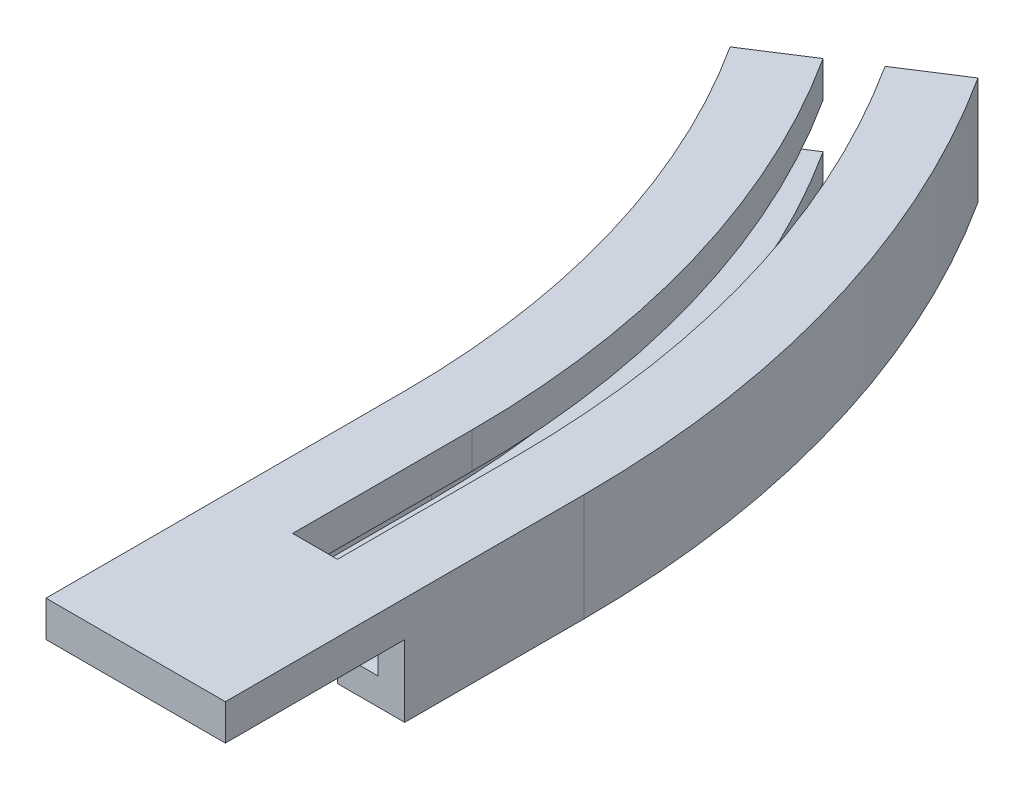
ISO-10303-21;
HEADER;
FILE_DESCRIPTION(('STEP AP214'),'2;1');
FILE_NAME('part.step','',(''),(''),'','','');
FILE_SCHEMA(('AUTOMOTIVE_DESIGN { 1 0 10303 214 1 1 1 1 }'));
ENDSEC;
DATA;
#1=APPLICATION_CONTEXT('core data for automotive mechanical design processes');
#2=APPLICATION_PROTOCOL_DEFINITION('international standard','automotive_design',2000,#1);
#3=PRODUCT_CONTEXT('',#1,'mechanical');
#4=PRODUCT('Part','Part','',(#3));
#5=PRODUCT_RELATED_PRODUCT_CATEGORY('part','',(#4));
#6=PRODUCT_DEFINITION_FORMATION('','',#4);
#7=PRODUCT_DEFINITION_CONTEXT('part definition',#1,'design');
#8=PRODUCT_DEFINITION('design','',#6,#7);
#9=PRODUCT_DEFINITION_SHAPE('','',#8);
#10=(LENGTH_UNIT() NAMED_UNIT(*) SI_UNIT(.MILLI.,.METRE.));
#11=(NAMED_UNIT(*) PLANE_ANGLE_UNIT() SI_UNIT($,.RADIAN.));
#12=(NAMED_UNIT(*) SI_UNIT($,.STERADIAN.) SOLID_ANGLE_UNIT());
#13=UNCERTAINTY_MEASURE_WITH_UNIT(LENGTH_MEASURE(1.E-05),#10,'distance_accuracy_value','');
#14=(GEOMETRIC_REPRESENTATION_CONTEXT(3) GLOBAL_UNCERTAINTY_ASSIGNED_CONTEXT((#13)) GLOBAL_UNIT_ASSIGNED_CONTEXT((#10,
#11,#12)) REPRESENTATION_CONTEXT('',''));
#15=CARTESIAN_POINT('',(0.,0.,0.));
#16=DIRECTION('',(0.,0.,1.));
#17=DIRECTION('',(1.,0.,0.));
#18=AXIS2_PLACEMENT_3D('',#15,#16,#17);
#19=CARTESIAN_POINT('',(0.,4.,0.));
#20=DIRECTION('',(-0.540827674130089,0.,-0.841133418011101));
#21=DIRECTION('',(-0.841133418011101,0.,0.540827674130089));
#22=AXIS2_PLACEMENT_3D('',#19,#20,#21);
#23=PLANE('',#22);
#24=DIRECTION('',(0.,1.,0.));
#25=VECTOR('',#24,1.);
#26=CARTESIAN_POINT('',(90.4218424361934,-39.,-58.1389749689846));
#27=LINE('',#26,#25);
#28=CARTESIAN_POINT('',(90.4218424361934,-8.,-58.1389749689846));
#29=VERTEX_POINT('',#28);
#30=CARTESIAN_POINT('',(90.4218424361934,-5.,-58.1389749689846));
#31=VERTEX_POINT('',#30);
#32=EDGE_CURVE('E249',#29,#31,#27,.T.);
#33=ORIENTED_EDGE('',*,*,#32,.T.);
#34=DIRECTION('',(0.84113341801112,0.,-0.54082767413006));
#35=VECTOR('',#34,1.);
#36=CARTESIAN_POINT('',(94.2069428172436,-5.,-60.5726995025703));
#37=LINE('',#36,#35);
#38=CARTESIAN_POINT('',(94.2069428172433,-5.,-60.57269950257));
#39=VERTEX_POINT('',#38);
#40=EDGE_CURVE('E304',#31,#39,#37,.T.);
#41=ORIENTED_EDGE('',*,*,#40,.T.);
#42=DIRECTION('',(0.,1.,0.));
#43=VECTOR('',#42,1.);
#44=CARTESIAN_POINT('',(94.206942817244,-5.,-60.5726995025704));
#45=LINE('',#44,#43);
#46=CARTESIAN_POINT('',(94.2069428172433,0.,-60.57269950257));
#47=VERTEX_POINT('',#46);
#48=EDGE_CURVE('E373',#39,#47,#45,.T.);
#49=ORIENTED_EDGE('',*,*,#48,.T.);
#50=DIRECTION('',(0.841133418011101,0.,-0.540827674130089));
#51=VECTOR('',#50,1.);
#52=CARTESIAN_POINT('',(0.,0.,0.));
#53=LINE('',#52,#51);
#54=CARTESIAN_POINT('',(90.4218424361934,0.,-58.1389749689846));
#55=VERTEX_POINT('',#54);
#56=EDGE_CURVE('E429',#55,#47,#53,.T.);
#57=ORIENTED_EDGE('',*,*,#56,.F.);
#58=DIRECTION('',(0.,-1.,0.));
#59=VECTOR('',#58,1.);
#60=CARTESIAN_POINT('',(90.4218424361934,4.,-58.1389749689846));
#61=LINE('',#60,#59);
#62=CARTESIAN_POINT('',(90.4218424361934,4.,-58.1389749689846));
#63=VERTEX_POINT('',#62);
#64=EDGE_CURVE('E472',#63,#55,#61,.T.);
#65=ORIENTED_EDGE('',*,*,#64,.F.);
#66=DIRECTION('',(0.841133418011101,0.,-0.540827674130089));
#67=VECTOR('',#66,1.);
#68=CARTESIAN_POINT('',(0.,4.,0.));
#69=LINE('',#68,#67);
#70=CARTESIAN_POINT('',(96.7303430712767,4.,-62.1951825249603));
#71=VERTEX_POINT('',#70);
#72=EDGE_CURVE('E395',#63,#71,#69,.T.);
#73=ORIENTED_EDGE('',*,*,#72,.T.);
#74=DIRECTION('',(0.,-1.,0.));
#75=VECTOR('',#74,1.);
#76=CARTESIAN_POINT('',(96.7303430712767,4.,-62.1951825249603));
#77=LINE('',#76,#75);
#78=CARTESIAN_POINT('',(96.7303430712767,-8.,-62.1951825249602));
#79=VERTEX_POINT('',#78);
#80=EDGE_CURVE('E269',#71,#79,#77,.T.);
#81=ORIENTED_EDGE('',*,*,#80,.T.);
#82=DIRECTION('',(0.841133418011101,0.,-0.54082767413009));
#83=VECTOR('',#82,1.);
#84=CARTESIAN_POINT('',(79.9076747110546,-8.,-51.3786290423585));
#85=LINE('',#84,#83);
#86=EDGE_CURVE('E264',#29,#79,#85,.T.);
#87=ORIENTED_EDGE('',*,*,#86,.F.);
#88=EDGE_LOOP('',(#33,#41,#49,#57,#65,#73,#81,#87));
#89=FACE_BOUND('',#88,.T.);
#90=ADVANCED_FACE('F77',(#89),#23,.T.);
#91=CARTESIAN_POINT('',(-1.15648231731783E-13,-5.,19.9999999999993));
#92=DIRECTION('',(0.,0.,-1.));
#93=DIRECTION('',(-1.,0.,0.));
#94=AXIS2_PLACEMENT_3D('',#91,#92,#93);
#95=PLANE('',#94);
#96=DIRECTION('',(-1.,0.,0.));
#97=VECTOR('',#96,1.);
#98=CARTESIAN_POINT('',(98.,-5.,20.));
#99=LINE('',#98,#97);
#100=CARTESIAN_POINT('',(112.,-5.,20.));
#101=VERTEX_POINT('',#100);
#102=CARTESIAN_POINT('',(107.5,-5.,20.));
#103=VERTEX_POINT('',#102);
#104=EDGE_CURVE('E280',#101,#103,#99,.T.);
#105=ORIENTED_EDGE('',*,*,#104,.T.);
#106=DIRECTION('',(0.,1.,0.));
#107=VECTOR('',#106,1.);
#108=CARTESIAN_POINT('',(107.5,-39.,20.));
#109=LINE('',#108,#107);
#110=CARTESIAN_POINT('',(107.5,-8.,20.));
#111=VERTEX_POINT('',#110);
#112=EDGE_CURVE('E499',#111,#103,#109,.T.);
#113=ORIENTED_EDGE('',*,*,#112,.F.);
#114=DIRECTION('',(-1.,0.,0.));
#115=VECTOR('',#114,1.);
#116=CARTESIAN_POINT('',(115.,-8.,20.));
#117=LINE('',#116,#115);
#118=CARTESIAN_POINT('',(115.,-8.,20.));
#119=VERTEX_POINT('',#118);
#120=EDGE_CURVE('E291',#119,#111,#117,.T.);
#121=ORIENTED_EDGE('',*,*,#120,.F.);
#122=DIRECTION('',(0.,1.,0.));
#123=VECTOR('',#122,1.);
#124=CARTESIAN_POINT('',(115.,-5.,20.));
#125=LINE('',#124,#123);
#126=CARTESIAN_POINT('',(115.,0.,20.));
#127=VERTEX_POINT('',#126);
#128=EDGE_CURVE('E369',#119,#127,#125,.T.);
#129=ORIENTED_EDGE('',*,*,#128,.T.);
#130=DIRECTION('',(-1.,0.,0.));
#131=VECTOR('',#130,1.);
#132=CARTESIAN_POINT('',(-1.15648231731783E-13,0.,19.9999999999993));
#133=LINE('',#132,#131);
#134=CARTESIAN_POINT('',(112.,0.,20.));
#135=VERTEX_POINT('',#134);
#136=EDGE_CURVE('E356',#127,#135,#133,.T.);
#137=ORIENTED_EDGE('',*,*,#136,.T.);
#138=DIRECTION('',(0.,1.,0.));
#139=VECTOR('',#138,1.);
#140=CARTESIAN_POINT('',(112.,-5.,20.));
#141=LINE('',#140,#139);
#142=EDGE_CURVE('E365',#101,#135,#141,.T.);
#143=ORIENTED_EDGE('',*,*,#142,.F.);
#144=EDGE_LOOP('',(#105,#113,#121,#129,#137,#143));
#145=FACE_BOUND('',#144,.T.);
#146=ADVANCED_FACE('F503',(#145),#95,.F.);
#147=CARTESIAN_POINT('',(0.,-5.,0.));
#148=DIRECTION('',(0.,-1.,0.));
#149=DIRECTION('',(0.,0.,-1.));
#150=AXIS2_PLACEMENT_3D('',#147,#148,#149);
#151=PLANE('',#150);
#152=ORIENTED_EDGE('',*,*,#40,.F.);
#153=CARTESIAN_POINT('',(0.,-5.,0.));
#154=DIRECTION('',(0.,-1.,0.));
#155=DIRECTION('',(0.,0.,-1.));
#156=AXIS2_PLACEMENT_3D('',#153,#154,#155);
#157=CIRCLE('',#156,107.5);
#158=CARTESIAN_POINT('',(107.5,-5.,0.));
#159=VERTEX_POINT('',#158);
#160=EDGE_CURVE('E254',#31,#159,#157,.T.);
#161=ORIENTED_EDGE('',*,*,#160,.T.);
#162=DIRECTION('',(0.,0.,1.));
#163=VECTOR('',#162,1.);
#164=CARTESIAN_POINT('',(107.5,-5.,0.));
#165=LINE('',#164,#163);
#166=EDGE_CURVE('E527',#159,#103,#165,.T.);
#167=ORIENTED_EDGE('',*,*,#166,.T.);
#168=ORIENTED_EDGE('',*,*,#104,.F.);
#169=DIRECTION('',(0.,0.,1.));
#170=VECTOR('',#169,1.);
#171=CARTESIAN_POINT('',(112.,-5.,0.));
#172=LINE('',#171,#170);
#173=CARTESIAN_POINT('',(112.,-5.,0.));
#174=VERTEX_POINT('',#173);
#175=EDGE_CURVE('E348',#174,#101,#172,.T.);
#176=ORIENTED_EDGE('',*,*,#175,.F.);
#177=CARTESIAN_POINT('',(0.,-5.,0.));
#178=DIRECTION('',(0.,-1.,0.));
#179=DIRECTION('',(0.,0.,-1.));
#180=AXIS2_PLACEMENT_3D('',#177,#178,#179);
#181=CIRCLE('',#180,112.);
#182=EDGE_CURVE('E344',#39,#174,#181,.T.);
#183=ORIENTED_EDGE('',*,*,#182,.F.);
#184=EDGE_LOOP('',(#152,#161,#167,#168,#176,#183));
#185=FACE_BOUND('',#184,.T.);
#186=ADVANCED_FACE('F525',(#185),#151,.F.);
#187=CARTESIAN_POINT('',(0.,-8.,0.));
#188=DIRECTION('',(0.,-1.,0.));
#189=DIRECTION('',(0.,0.,-1.));
#190=AXIS2_PLACEMENT_3D('',#187,#188,#189);
#191=PLANE('',#190);
#192=CARTESIAN_POINT('',(0.,-8.,0.));
#193=DIRECTION('',(0.,-1.,0.));
#194=DIRECTION('',(0.,0.,-1.));
#195=AXIS2_PLACEMENT_3D('',#192,#193,#194);
#196=CIRCLE('',#195,107.5);
#197=CARTESIAN_POINT('',(107.5,-8.,0.));
#198=VERTEX_POINT('',#197);
#199=EDGE_CURVE('E12',#29,#198,#196,.T.);
#200=ORIENTED_EDGE('',*,*,#199,.F.);
#201=ORIENTED_EDGE('',*,*,#86,.T.);
#202=CARTESIAN_POINT('',(0.,-8.,0.));
#203=DIRECTION('',(0.,-1.,0.));
#204=DIRECTION('',(0.,0.,-1.));
#205=AXIS2_PLACEMENT_3D('',#202,#203,#204);
#206=CIRCLE('',#205,115.);
#207=CARTESIAN_POINT('',(115.,-8.,0.));
#208=VERTEX_POINT('',#207);
#209=EDGE_CURVE('E278',#79,#208,#206,.T.);
#210=ORIENTED_EDGE('',*,*,#209,.T.);
#211=DIRECTION('',(0.,0.,1.));
#212=VECTOR('',#211,1.);
#213=CARTESIAN_POINT('',(115.,-8.,0.));
#214=LINE('',#213,#212);
#215=EDGE_CURVE('E286',#208,#119,#214,.T.);
#216=ORIENTED_EDGE('',*,*,#215,.T.);
#217=ORIENTED_EDGE('',*,*,#120,.T.);
#218=DIRECTION('',(0.,0.,1.));
#219=VECTOR('',#218,1.);
#220=CARTESIAN_POINT('',(107.5,-8.,0.));
#221=LINE('',#220,#219);
#222=EDGE_CURVE('E86',#198,#111,#221,.T.);
#223=ORIENTED_EDGE('',*,*,#222,.F.);
#224=EDGE_LOOP('',(#200,#201,#210,#216,#217,#223));
#225=FACE_BOUND('',#224,.T.);
#226=ADVANCED_FACE('F262',(#225),#191,.T.);
#227=CARTESIAN_POINT('',(0.,0.,0.));
#228=DIRECTION('',(0.,1.,0.));
#229=DIRECTION('',(0.,0.,1.));
#230=AXIS2_PLACEMENT_3D('',#227,#228,#229);
#231=PLANE('',#230);
#232=CARTESIAN_POINT('',(0.,0.,0.));
#233=DIRECTION('',(0.,-1.,0.));
#234=DIRECTION('',(0.,0.,-1.));
#235=AXIS2_PLACEMENT_3D('',#232,#233,#234);
#236=CIRCLE('',#235,98.);
#237=CARTESIAN_POINT('',(82.4310749650879,0.,-53.0011120647488));
#238=VERTEX_POINT('',#237);
#239=CARTESIAN_POINT('',(98.,0.,0.));
#240=VERTEX_POINT('',#239);
#241=EDGE_CURVE('E298',#238,#240,#236,.T.);
#242=ORIENTED_EDGE('',*,*,#241,.F.);
#243=DIRECTION('',(0.841133418011101,0.,-0.540827674130089));
#244=VECTOR('',#243,1.);
#245=CARTESIAN_POINT('',(0.,0.,0.));
#246=LINE('',#245,#244);
#247=CARTESIAN_POINT('',(86.2161753461379,0.,-55.4348365983342));
#248=VERTEX_POINT('',#247);
#249=EDGE_CURVE('E383',#238,#248,#246,.T.);
#250=ORIENTED_EDGE('',*,*,#249,.T.);
#251=CARTESIAN_POINT('',(0.,0.,0.));
#252=DIRECTION('',(0.,1.,0.));
#253=DIRECTION('',(0.,0.,1.));
#254=AXIS2_PLACEMENT_3D('',#251,#252,#253);
#255=CIRCLE('',#254,102.5);
#256=CARTESIAN_POINT('',(102.5,0.,0.));
#257=VERTEX_POINT('',#256);
#258=EDGE_CURVE('E447',#257,#248,#255,.T.);
#259=ORIENTED_EDGE('',*,*,#258,.F.);
#260=DIRECTION('',(0.,0.,1.));
#261=VECTOR('',#260,1.);
#262=CARTESIAN_POINT('',(102.5,0.,0.));
#263=LINE('',#262,#261);
#264=CARTESIAN_POINT('',(102.5,0.,20.));
#265=VERTEX_POINT('',#264);
#266=EDGE_CURVE('E443',#257,#265,#263,.T.);
#267=ORIENTED_EDGE('',*,*,#266,.T.);
#268=DIRECTION('',(-1.,0.,0.));
#269=VECTOR('',#268,1.);
#270=CARTESIAN_POINT('',(0.,0.,20.));
#271=LINE('',#270,#269);
#272=CARTESIAN_POINT('',(107.5,0.,20.));
#273=VERTEX_POINT('',#272);
#274=EDGE_CURVE('E439',#273,#265,#271,.T.);
#275=ORIENTED_EDGE('',*,*,#274,.F.);
#276=DIRECTION('',(0.,0.,1.));
#277=VECTOR('',#276,1.);
#278=CARTESIAN_POINT('',(107.5,0.,0.));
#279=LINE('',#278,#277);
#280=CARTESIAN_POINT('',(107.5,0.,0.));
#281=VERTEX_POINT('',#280);
#282=EDGE_CURVE('E436',#281,#273,#279,.T.);
#283=ORIENTED_EDGE('',*,*,#282,.F.);
#284=CARTESIAN_POINT('',(0.,0.,0.));
#285=DIRECTION('',(0.,1.,0.));
#286=DIRECTION('',(0.,0.,1.));
#287=AXIS2_PLACEMENT_3D('',#284,#285,#286);
#288=CIRCLE('',#287,107.5);
#289=EDGE_CURVE('E432',#281,#55,#288,.T.);
#290=ORIENTED_EDGE('',*,*,#289,.T.);
#291=ORIENTED_EDGE('',*,*,#56,.T.);
#292=CARTESIAN_POINT('',(0.,0.,0.));
#293=DIRECTION('',(0.,-1.,0.));
#294=DIRECTION('',(0.,0.,-1.));
#295=AXIS2_PLACEMENT_3D('',#292,#293,#294);
#296=CIRCLE('',#295,112.);
#297=CARTESIAN_POINT('',(112.,0.,0.));
#298=VERTEX_POINT('',#297);
#299=EDGE_CURVE('E343',#47,#298,#296,.T.);
#300=ORIENTED_EDGE('',*,*,#299,.T.);
#301=DIRECTION('',(0.,0.,1.));
#302=VECTOR('',#301,1.);
#303=CARTESIAN_POINT('',(112.,0.,0.));
#304=LINE('',#303,#302);
#305=EDGE_CURVE('E349',#298,#135,#304,.T.);
#306=ORIENTED_EDGE('',*,*,#305,.T.);
#307=ORIENTED_EDGE('',*,*,#136,.F.);
#308=DIRECTION('',(0.,0.,-1.));
#309=VECTOR('',#308,1.);
#310=CARTESIAN_POINT('',(115.,0.,0.));
#311=LINE('',#310,#309);
#312=CARTESIAN_POINT('',(115.,0.,40.));
#313=VERTEX_POINT('',#312);
#314=EDGE_CURVE('E425',#313,#127,#311,.T.);
#315=ORIENTED_EDGE('',*,*,#314,.F.);
#316=DIRECTION('',(1.,0.,0.));
#317=VECTOR('',#316,1.);
#318=CARTESIAN_POINT('',(0.,0.,40.));
#319=LINE('',#318,#317);
#320=CARTESIAN_POINT('',(95.,0.,40.));
#321=VERTEX_POINT('',#320);
#322=EDGE_CURVE('E422',#321,#313,#319,.T.);
#323=ORIENTED_EDGE('',*,*,#322,.F.);
#324=DIRECTION('',(0.,0.,1.));
#325=VECTOR('',#324,1.);
#326=CARTESIAN_POINT('',(95.,0.,0.));
#327=LINE('',#326,#325);
#328=CARTESIAN_POINT('',(95.,0.,20.));
#329=VERTEX_POINT('',#328);
#330=EDGE_CURVE('E377',#329,#321,#327,.T.);
#331=ORIENTED_EDGE('',*,*,#330,.F.);
#332=DIRECTION('',(-1.,0.,0.));
#333=VECTOR('',#332,1.);
#334=CARTESIAN_POINT('',(0.,0.,20.0000000000001));
#335=LINE('',#334,#333);
#336=CARTESIAN_POINT('',(98.,0.,20.));
#337=VERTEX_POINT('',#336);
#338=EDGE_CURVE('E313',#337,#329,#335,.T.);
#339=ORIENTED_EDGE('',*,*,#338,.F.);
#340=DIRECTION('',(0.,0.,1.));
#341=VECTOR('',#340,1.);
#342=CARTESIAN_POINT('',(98.,0.,0.));
#343=LINE('',#342,#341);
#344=EDGE_CURVE('E321',#240,#337,#343,.T.);
#345=ORIENTED_EDGE('',*,*,#344,.F.);
#346=EDGE_LOOP('',(#242,#250,#259,#267,#275,#283,#290,#291,#300,#306,#307,#315,#323,#331,#339,#345));
#347=FACE_BOUND('',#346,.T.);
#348=ADVANCED_FACE('F516',(#347),#231,.F.);
#349=CARTESIAN_POINT('',(0.,4.,0.));
#350=DIRECTION('',(0.,-1.,0.));
#351=DIRECTION('',(0.,0.,-1.));
#352=AXIS2_PLACEMENT_3D('',#349,#350,#351);
#353=CYLINDRICAL_SURFACE('',#352,95.);
#354=DIRECTION('',(0.,-1.,0.));
#355=VECTOR('',#354,1.);
#356=CARTESIAN_POINT('',(79.9076747110546,4.,-51.3786290423584));
#357=LINE('',#356,#355);
#358=CARTESIAN_POINT('',(79.9076747110546,4.,-51.3786290423584));
#359=VERTEX_POINT('',#358);
#360=CARTESIAN_POINT('',(79.9076747110546,-8.,-51.3786290423585));
#361=VERTEX_POINT('',#360);
#362=EDGE_CURVE('E419',#359,#361,#357,.T.);
#363=ORIENTED_EDGE('',*,*,#362,.T.);
#364=CARTESIAN_POINT('',(0.,-8.,0.));
#365=DIRECTION('',(0.,1.,0.));
#366=DIRECTION('',(0.,0.,-1.));
#367=AXIS2_PLACEMENT_3D('',#364,#365,#366);
#368=CIRCLE('',#367,95.);
#369=CARTESIAN_POINT('',(95.,-8.,0.));
#370=VERTEX_POINT('',#369);
#371=EDGE_CURVE('E273',#370,#361,#368,.T.);
#372=ORIENTED_EDGE('',*,*,#371,.F.);
#373=DIRECTION('',(0.,-1.,0.));
#374=VECTOR('',#373,1.);
#375=CARTESIAN_POINT('',(95.,4.,0.));
#376=LINE('',#375,#374);
#377=CARTESIAN_POINT('',(95.,4.,0.));
#378=VERTEX_POINT('',#377);
#379=EDGE_CURVE('E488',#378,#370,#376,.T.);
#380=ORIENTED_EDGE('',*,*,#379,.F.);
#381=CARTESIAN_POINT('',(0.,4.,0.));
#382=DIRECTION('',(0.,1.,0.));
#383=DIRECTION('',(0.,0.,1.));
#384=AXIS2_PLACEMENT_3D('',#381,#382,#383);
#385=CIRCLE('',#384,95.);
#386=EDGE_CURVE('E378',#378,#359,#385,.T.);
#387=ORIENTED_EDGE('',*,*,#386,.T.);
#388=EDGE_LOOP('',(#363,#372,#380,#387));
#389=FACE_BOUND('',#388,.T.);
#390=ADVANCED_FACE('F79',(#389),#353,.F.);
#391=CARTESIAN_POINT('',(95.,4.,0.));
#392=DIRECTION('',(1.,0.,0.));
#393=DIRECTION('',(0.,0.,-1.));
#394=AXIS2_PLACEMENT_3D('',#391,#392,#393);
#395=PLANE('',#394);
#396=ORIENTED_EDGE('',*,*,#379,.T.);
#397=DIRECTION('',(0.,0.,-1.));
#398=VECTOR('',#397,1.);
#399=CARTESIAN_POINT('',(95.,-8.,20.));
#400=LINE('',#399,#398);
#401=CARTESIAN_POINT('',(95.,-8.,20.));
#402=VERTEX_POINT('',#401);
#403=EDGE_CURVE('E294',#402,#370,#400,.T.);
#404=ORIENTED_EDGE('',*,*,#403,.F.);
#405=DIRECTION('',(0.,1.,0.));
#406=VECTOR('',#405,1.);
#407=CARTESIAN_POINT('',(95.,-5.,20.));
#408=LINE('',#407,#406);
#409=EDGE_CURVE('E317',#402,#329,#408,.T.);
#410=ORIENTED_EDGE('',*,*,#409,.T.);
#411=ORIENTED_EDGE('',*,*,#330,.T.);
#412=DIRECTION('',(0.,-1.,0.));
#413=VECTOR('',#412,1.);
#414=CARTESIAN_POINT('',(95.,4.,40.));
#415=LINE('',#414,#413);
#416=CARTESIAN_POINT('',(95.,4.,40.));
#417=VERTEX_POINT('',#416);
#418=EDGE_CURVE('E484',#417,#321,#415,.T.);
#419=ORIENTED_EDGE('',*,*,#418,.F.);
#420=DIRECTION('',(0.,0.,1.));
#421=VECTOR('',#420,1.);
#422=CARTESIAN_POINT('',(95.,4.,0.));
#423=LINE('',#422,#421);
#424=EDGE_CURVE('E382',#378,#417,#423,.T.);
#425=ORIENTED_EDGE('',*,*,#424,.F.);
#426=EDGE_LOOP('',(#396,#404,#410,#411,#419,#425));
#427=FACE_BOUND('',#426,.T.);
#428=ADVANCED_FACE('F639',(#427),#395,.F.);
#429=CARTESIAN_POINT('',(0.,4.,40.));
#430=DIRECTION('',(0.,0.,-1.));
#431=DIRECTION('',(-1.,0.,0.));
#432=AXIS2_PLACEMENT_3D('',#429,#430,#431);
#433=PLANE('',#432);
#434=ORIENTED_EDGE('',*,*,#322,.T.);
#435=DIRECTION('',(0.,-1.,0.));
#436=VECTOR('',#435,1.);
#437=CARTESIAN_POINT('',(115.,4.,40.));
#438=LINE('',#437,#436);
#439=CARTESIAN_POINT('',(115.,4.,40.));
#440=VERTEX_POINT('',#439);
#441=EDGE_CURVE('E480',#440,#313,#438,.T.);
#442=ORIENTED_EDGE('',*,*,#441,.F.);
#443=DIRECTION('',(1.,0.,0.));
#444=VECTOR('',#443,1.);
#445=CARTESIAN_POINT('',(0.,4.,40.));
#446=LINE('',#445,#444);
#447=EDGE_CURVE('E386',#417,#440,#446,.T.);
#448=ORIENTED_EDGE('',*,*,#447,.F.);
#449=ORIENTED_EDGE('',*,*,#418,.T.);
#450=EDGE_LOOP('',(#434,#442,#448,#449));
#451=FACE_BOUND('',#450,.T.);
#452=ADVANCED_FACE('F634',(#451),#433,.F.);
#453=CARTESIAN_POINT('',(115.,4.,0.));
#454=DIRECTION('',(-1.,0.,0.));
#455=DIRECTION('',(0.,0.,1.));
#456=AXIS2_PLACEMENT_3D('',#453,#454,#455);
#457=PLANE('',#456);
#458=ORIENTED_EDGE('',*,*,#314,.T.);
#459=ORIENTED_EDGE('',*,*,#128,.F.);
#460=ORIENTED_EDGE('',*,*,#215,.F.);
#461=DIRECTION('',(0.,-1.,0.));
#462=VECTOR('',#461,1.);
#463=CARTESIAN_POINT('',(115.,4.,0.));
#464=LINE('',#463,#462);
#465=CARTESIAN_POINT('',(115.,4.,0.));
#466=VERTEX_POINT('',#465);
#467=EDGE_CURVE('E477',#466,#208,#464,.T.);
#468=ORIENTED_EDGE('',*,*,#467,.F.);
#469=DIRECTION('',(0.,0.,-1.));
#470=VECTOR('',#469,1.);
#471=CARTESIAN_POINT('',(115.,4.,0.));
#472=LINE('',#471,#470);
#473=EDGE_CURVE('E389',#440,#466,#472,.T.);
#474=ORIENTED_EDGE('',*,*,#473,.F.);
#475=ORIENTED_EDGE('',*,*,#441,.T.);
#476=EDGE_LOOP('',(#458,#459,#460,#468,#474,#475));
#477=FACE_BOUND('',#476,.T.);
#478=ADVANCED_FACE('F511',(#477),#457,.F.);
#479=CARTESIAN_POINT('',(0.,4.,0.));
#480=DIRECTION('',(0.,-1.,0.));
#481=DIRECTION('',(0.,0.,-1.));
#482=AXIS2_PLACEMENT_3D('',#479,#480,#481);
#483=CYLINDRICAL_SURFACE('',#482,115.);
#484=ORIENTED_EDGE('',*,*,#467,.T.);
#485=ORIENTED_EDGE('',*,*,#209,.F.);
#486=ORIENTED_EDGE('',*,*,#80,.F.);
#487=CARTESIAN_POINT('',(0.,4.,0.));
#488=DIRECTION('',(0.,1.,0.));
#489=DIRECTION('',(0.,0.,1.));
#490=AXIS2_PLACEMENT_3D('',#487,#488,#489);
#491=CIRCLE('',#490,115.);
#492=EDGE_CURVE('E392',#466,#71,#491,.T.);
#493=ORIENTED_EDGE('',*,*,#492,.F.);
#494=EDGE_LOOP('',(#484,#485,#486,#493));
#495=FACE_BOUND('',#494,.T.);
#496=ADVANCED_FACE('F625',(#495),#483,.T.);
#497=CARTESIAN_POINT('',(0.,4.,0.));
#498=DIRECTION('',(0.,-1.,0.));
#499=DIRECTION('',(0.,0.,-1.));
#500=AXIS2_PLACEMENT_3D('',#497,#498,#499);
#501=CYLINDRICAL_SURFACE('',#500,107.5);
#502=ORIENTED_EDGE('',*,*,#289,.F.);
#503=DIRECTION('',(0.,-1.,0.));
#504=VECTOR('',#503,1.);
#505=CARTESIAN_POINT('',(107.5,4.,0.));
#506=LINE('',#505,#504);
#507=CARTESIAN_POINT('',(107.5,4.,0.));
#508=VERTEX_POINT('',#507);
#509=EDGE_CURVE('E469',#508,#281,#506,.T.);
#510=ORIENTED_EDGE('',*,*,#509,.F.);
#511=CARTESIAN_POINT('',(0.,4.,0.));
#512=DIRECTION('',(0.,1.,0.));
#513=DIRECTION('',(0.,0.,1.));
#514=AXIS2_PLACEMENT_3D('',#511,#512,#513);
#515=CIRCLE('',#514,107.5);
#516=EDGE_CURVE('E398',#508,#63,#515,.T.);
#517=ORIENTED_EDGE('',*,*,#516,.T.);
#518=ORIENTED_EDGE('',*,*,#64,.T.);
#519=EDGE_LOOP('',(#502,#510,#517,#518));
#520=FACE_BOUND('',#519,.T.);
#521=ADVANCED_FACE('F620',(#520),#501,.F.);
#522=CARTESIAN_POINT('',(107.5,4.,0.));
#523=DIRECTION('',(1.,0.,0.));
#524=DIRECTION('',(0.,0.,-1.));
#525=AXIS2_PLACEMENT_3D('',#522,#523,#524);
#526=PLANE('',#525);
#527=ORIENTED_EDGE('',*,*,#282,.T.);
#528=DIRECTION('',(0.,-1.,0.));
#529=VECTOR('',#528,1.);
#530=CARTESIAN_POINT('',(107.5,4.,20.));
#531=LINE('',#530,#529);
#532=CARTESIAN_POINT('',(107.5,4.,20.));
#533=VERTEX_POINT('',#532);
#534=EDGE_CURVE('E465',#533,#273,#531,.T.);
#535=ORIENTED_EDGE('',*,*,#534,.F.);
#536=DIRECTION('',(0.,0.,1.));
#537=VECTOR('',#536,1.);
#538=CARTESIAN_POINT('',(107.5,4.,0.));
#539=LINE('',#538,#537);
#540=EDGE_CURVE('E402',#508,#533,#539,.T.);
#541=ORIENTED_EDGE('',*,*,#540,.F.);
#542=ORIENTED_EDGE('',*,*,#509,.T.);
#543=EDGE_LOOP('',(#527,#535,#541,#542));
#544=FACE_BOUND('',#543,.T.);
#545=ADVANCED_FACE('F632',(#544),#526,.F.);
#546=CARTESIAN_POINT('',(0.,4.,20.));
#547=DIRECTION('',(0.,0.,1.));
#548=DIRECTION('',(1.,0.,0.));
#549=AXIS2_PLACEMENT_3D('',#546,#547,#548);
#550=PLANE('',#549);
#551=ORIENTED_EDGE('',*,*,#274,.T.);
#552=DIRECTION('',(0.,-1.,0.));
#553=VECTOR('',#552,1.);
#554=CARTESIAN_POINT('',(102.5,4.,20.));
#555=LINE('',#554,#553);
#556=CARTESIAN_POINT('',(102.5,4.,20.));
#557=VERTEX_POINT('',#556);
#558=EDGE_CURVE('E462',#557,#265,#555,.T.);
#559=ORIENTED_EDGE('',*,*,#558,.F.);
#560=DIRECTION('',(-1.,0.,0.));
#561=VECTOR('',#560,1.);
#562=CARTESIAN_POINT('',(0.,4.,20.));
#563=LINE('',#562,#561);
#564=EDGE_CURVE('E405',#533,#557,#563,.T.);
#565=ORIENTED_EDGE('',*,*,#564,.F.);
#566=ORIENTED_EDGE('',*,*,#534,.T.);
#567=EDGE_LOOP('',(#551,#559,#565,#566));
#568=FACE_BOUND('',#567,.T.);
#569=ADVANCED_FACE('F614',(#568),#550,.F.);
#570=CARTESIAN_POINT('',(102.5,4.,0.));
#571=DIRECTION('',(1.,0.,0.));
#572=DIRECTION('',(0.,0.,-1.));
#573=AXIS2_PLACEMENT_3D('',#570,#571,#572);
#574=PLANE('',#573);
#575=ORIENTED_EDGE('',*,*,#266,.F.);
#576=DIRECTION('',(0.,-1.,0.));
#577=VECTOR('',#576,1.);
#578=CARTESIAN_POINT('',(102.5,4.,0.));
#579=LINE('',#578,#577);
#580=CARTESIAN_POINT('',(102.5,4.,0.));
#581=VERTEX_POINT('',#580);
#582=EDGE_CURVE('E459',#581,#257,#579,.T.);
#583=ORIENTED_EDGE('',*,*,#582,.F.);
#584=DIRECTION('',(0.,0.,1.));
#585=VECTOR('',#584,1.);
#586=CARTESIAN_POINT('',(102.5,4.,0.));
#587=LINE('',#586,#585);
#588=EDGE_CURVE('E408',#581,#557,#587,.T.);
#589=ORIENTED_EDGE('',*,*,#588,.T.);
#590=ORIENTED_EDGE('',*,*,#558,.T.);
#591=EDGE_LOOP('',(#575,#583,#589,#590));
#592=FACE_BOUND('',#591,.T.);
#593=ADVANCED_FACE('F588',(#592),#574,.T.);
#594=CARTESIAN_POINT('',(0.,4.,0.));
#595=DIRECTION('',(0.,-1.,0.));
#596=DIRECTION('',(0.,0.,-1.));
#597=AXIS2_PLACEMENT_3D('',#594,#595,#596);
#598=CYLINDRICAL_SURFACE('',#597,102.5);
#599=ORIENTED_EDGE('',*,*,#258,.T.);
#600=DIRECTION('',(0.,-1.,0.));
#601=VECTOR('',#600,1.);
#602=CARTESIAN_POINT('',(86.2161753461379,4.,-55.4348365983342));
#603=LINE('',#602,#601);
#604=CARTESIAN_POINT('',(86.2161753461379,4.,-55.4348365983342));
#605=VERTEX_POINT('',#604);
#606=EDGE_CURVE('E455',#605,#248,#603,.T.);
#607=ORIENTED_EDGE('',*,*,#606,.F.);
#608=CARTESIAN_POINT('',(0.,4.,0.));
#609=DIRECTION('',(0.,1.,0.));
#610=DIRECTION('',(0.,0.,1.));
#611=AXIS2_PLACEMENT_3D('',#608,#609,#610);
#612=CIRCLE('',#611,102.5);
#613=EDGE_CURVE('E412',#581,#605,#612,.T.);
#614=ORIENTED_EDGE('',*,*,#613,.F.);
#615=ORIENTED_EDGE('',*,*,#582,.T.);
#616=EDGE_LOOP('',(#599,#607,#614,#615));
#617=FACE_BOUND('',#616,.T.);
#618=ADVANCED_FACE('F583',(#617),#598,.T.);
#619=DIRECTION('',(0.,1.,0.));
#620=VECTOR('',#619,1.);
#621=CARTESIAN_POINT('',(86.2161753461379,-39.,-55.4348365983342));
#622=LINE('',#621,#620);
#623=CARTESIAN_POINT('',(86.2161753461379,-8.,-55.4348365983342));
#624=VERTEX_POINT('',#623);
#625=CARTESIAN_POINT('',(86.2161753461379,-5.,-55.4348365983342));
#626=VERTEX_POINT('',#625);
#627=EDGE_CURVE('E259',#624,#626,#622,.T.);
#628=ORIENTED_EDGE('',*,*,#627,.F.);
#629=EDGE_CURVE('E272',#361,#624,#85,.T.);
#630=ORIENTED_EDGE('',*,*,#629,.F.);
#631=ORIENTED_EDGE('',*,*,#362,.F.);
#632=DIRECTION('',(0.841133418011101,0.,-0.540827674130089));
#633=VECTOR('',#632,1.);
#634=CARTESIAN_POINT('',(0.,4.,0.));
#635=LINE('',#634,#633);
#636=EDGE_CURVE('E415',#359,#605,#635,.T.);
#637=ORIENTED_EDGE('',*,*,#636,.T.);
#638=ORIENTED_EDGE('',*,*,#606,.T.);
#639=ORIENTED_EDGE('',*,*,#249,.F.);
#640=DIRECTION('',(0.,1.,0.));
#641=VECTOR('',#640,1.);
#642=CARTESIAN_POINT('',(82.4310749650879,-5.,-53.0011120647487));
#643=LINE('',#642,#641);
#644=CARTESIAN_POINT('',(82.4310749650879,-5.,-53.0011120647487));
#645=VERTEX_POINT('',#644);
#646=EDGE_CURVE('E339',#645,#238,#643,.T.);
#647=ORIENTED_EDGE('',*,*,#646,.F.);
#648=EDGE_CURVE('E299',#645,#626,#37,.T.);
#649=ORIENTED_EDGE('',*,*,#648,.T.);
#650=EDGE_LOOP('',(#628,#630,#631,#637,#638,#639,#647,#649));
#651=FACE_BOUND('',#650,.T.);
#652=ADVANCED_FACE('F572',(#651),#23,.T.);
#653=CARTESIAN_POINT('',(0.,4.,0.));
#654=DIRECTION('',(0.,1.,0.));
#655=DIRECTION('',(0.,0.,1.));
#656=AXIS2_PLACEMENT_3D('',#653,#654,#655);
#657=PLANE('',#656);
#658=ORIENTED_EDGE('',*,*,#386,.F.);
#659=ORIENTED_EDGE('',*,*,#424,.T.);
#660=ORIENTED_EDGE('',*,*,#447,.T.);
#661=ORIENTED_EDGE('',*,*,#473,.T.);
#662=ORIENTED_EDGE('',*,*,#492,.T.);
#663=ORIENTED_EDGE('',*,*,#72,.F.);
#664=ORIENTED_EDGE('',*,*,#516,.F.);
#665=ORIENTED_EDGE('',*,*,#540,.T.);
#666=ORIENTED_EDGE('',*,*,#564,.T.);
#667=ORIENTED_EDGE('',*,*,#588,.F.);
#668=ORIENTED_EDGE('',*,*,#613,.T.);
#669=ORIENTED_EDGE('',*,*,#636,.F.);
#670=EDGE_LOOP('',(#658,#659,#660,#661,#662,#663,#664,#665,#666,#667,#668,#669));
#671=FACE_BOUND('',#670,.T.);
#672=ADVANCED_FACE('F565',(#671),#657,.T.);
#673=CARTESIAN_POINT('',(0.,-5.,0.));
#674=DIRECTION('',(0.,1.,0.));
#675=DIRECTION('',(0.,0.,1.));
#676=AXIS2_PLACEMENT_3D('',#673,#674,#675);
#677=CYLINDRICAL_SURFACE('',#676,112.);
#678=ORIENTED_EDGE('',*,*,#299,.F.);
#679=ORIENTED_EDGE('',*,*,#48,.F.);
#680=ORIENTED_EDGE('',*,*,#182,.T.);
#681=DIRECTION('',(0.,1.,0.));
#682=VECTOR('',#681,1.);
#683=CARTESIAN_POINT('',(112.,-5.,0.));
#684=LINE('',#683,#682);
#685=EDGE_CURVE('E353',#174,#298,#684,.T.);
#686=ORIENTED_EDGE('',*,*,#685,.T.);
#687=EDGE_LOOP('',(#678,#679,#680,#686));
#688=FACE_BOUND('',#687,.T.);
#689=ADVANCED_FACE('F563',(#688),#677,.F.);
#690=CARTESIAN_POINT('',(102.5,-8.,20.));
#691=VERTEX_POINT('',#690);
#692=EDGE_CURVE('E290',#691,#402,#117,.T.);
#693=ORIENTED_EDGE('',*,*,#692,.F.);
#694=DIRECTION('',(0.,1.,0.));
#695=VECTOR('',#694,1.);
#696=CARTESIAN_POINT('',(102.5,-39.,20.));
#697=LINE('',#696,#695);
#698=CARTESIAN_POINT('',(102.5,-5.,20.));
#699=VERTEX_POINT('',#698);
#700=EDGE_CURVE('E506',#691,#699,#697,.T.);
#701=ORIENTED_EDGE('',*,*,#700,.T.);
#702=CARTESIAN_POINT('',(98.,-5.,20.));
#703=VERTEX_POINT('',#702);
#704=EDGE_CURVE('E303',#699,#703,#99,.T.);
#705=ORIENTED_EDGE('',*,*,#704,.T.);
#706=DIRECTION('',(0.,1.,0.));
#707=VECTOR('',#706,1.);
#708=CARTESIAN_POINT('',(98.,-5.,20.));
#709=LINE('',#708,#707);
#710=EDGE_CURVE('E331',#703,#337,#709,.T.);
#711=ORIENTED_EDGE('',*,*,#710,.T.);
#712=ORIENTED_EDGE('',*,*,#338,.T.);
#713=ORIENTED_EDGE('',*,*,#409,.F.);
#714=EDGE_LOOP('',(#693,#701,#705,#711,#712,#713));
#715=FACE_BOUND('',#714,.T.);
#716=ADVANCED_FACE('F551',(#715),#95,.F.);
#717=CARTESIAN_POINT('',(112.,-5.,0.));
#718=DIRECTION('',(-1.,0.,0.));
#719=DIRECTION('',(0.,0.,1.));
#720=AXIS2_PLACEMENT_3D('',#717,#718,#719);
#721=PLANE('',#720);
#722=ORIENTED_EDGE('',*,*,#305,.F.);
#723=ORIENTED_EDGE('',*,*,#685,.F.);
#724=ORIENTED_EDGE('',*,*,#175,.T.);
#725=ORIENTED_EDGE('',*,*,#142,.T.);
#726=EDGE_LOOP('',(#722,#723,#724,#725));
#727=FACE_BOUND('',#726,.T.);
#728=ADVANCED_FACE('F522',(#727),#721,.T.);
#729=CARTESIAN_POINT('',(0.,-5.,0.));
#730=DIRECTION('',(0.,1.,0.));
#731=DIRECTION('',(0.,0.,1.));
#732=AXIS2_PLACEMENT_3D('',#729,#730,#731);
#733=CYLINDRICAL_SURFACE('',#732,98.);
#734=ORIENTED_EDGE('',*,*,#241,.T.);
#735=DIRECTION('',(0.,1.,0.));
#736=VECTOR('',#735,1.);
#737=CARTESIAN_POINT('',(98.,-5.,0.));
#738=LINE('',#737,#736);
#739=CARTESIAN_POINT('',(98.,-5.,0.));
#740=VERTEX_POINT('',#739);
#741=EDGE_CURVE('E335',#740,#240,#738,.T.);
#742=ORIENTED_EDGE('',*,*,#741,.F.);
#743=CARTESIAN_POINT('',(0.,-5.,0.));
#744=DIRECTION('',(0.,-1.,0.));
#745=DIRECTION('',(0.,0.,-1.));
#746=AXIS2_PLACEMENT_3D('',#743,#744,#745);
#747=CIRCLE('',#746,98.);
#748=EDGE_CURVE('E308',#645,#740,#747,.T.);
#749=ORIENTED_EDGE('',*,*,#748,.F.);
#750=ORIENTED_EDGE('',*,*,#646,.T.);
#751=EDGE_LOOP('',(#734,#742,#749,#750));
#752=FACE_BOUND('',#751,.T.);
#753=ADVANCED_FACE('F652',(#752),#733,.T.);
#754=CARTESIAN_POINT('',(98.,-5.,0.));
#755=DIRECTION('',(-1.,0.,0.));
#756=DIRECTION('',(0.,0.,1.));
#757=AXIS2_PLACEMENT_3D('',#754,#755,#756);
#758=PLANE('',#757);
#759=ORIENTED_EDGE('',*,*,#344,.T.);
#760=ORIENTED_EDGE('',*,*,#710,.F.);
#761=DIRECTION('',(0.,0.,1.));
#762=VECTOR('',#761,1.);
#763=CARTESIAN_POINT('',(98.,-5.,0.));
#764=LINE('',#763,#762);
#765=EDGE_CURVE('E312',#740,#703,#764,.T.);
#766=ORIENTED_EDGE('',*,*,#765,.F.);
#767=ORIENTED_EDGE('',*,*,#741,.T.);
#768=EDGE_LOOP('',(#759,#760,#766,#767));
#769=FACE_BOUND('',#768,.T.);
#770=ADVANCED_FACE('F650',(#769),#758,.F.);
#771=ORIENTED_EDGE('',*,*,#704,.F.);
#772=DIRECTION('',(0.,0.,-1.));
#773=VECTOR('',#772,1.);
#774=CARTESIAN_POINT('',(102.5,-5.,0.));
#775=LINE('',#774,#773);
#776=CARTESIAN_POINT('',(102.5,-5.,0.));
#777=VERTEX_POINT('',#776);
#778=EDGE_CURVE('E529',#699,#777,#775,.T.);
#779=ORIENTED_EDGE('',*,*,#778,.T.);
#780=CARTESIAN_POINT('',(0.,-5.,0.));
#781=DIRECTION('',(0.,-1.,0.));
#782=DIRECTION('',(0.,0.,-1.));
#783=AXIS2_PLACEMENT_3D('',#780,#781,#782);
#784=CIRCLE('',#783,102.5);
#785=EDGE_CURVE('E534',#777,#626,#784,.F.);
#786=ORIENTED_EDGE('',*,*,#785,.T.);
#787=ORIENTED_EDGE('',*,*,#648,.F.);
#788=ORIENTED_EDGE('',*,*,#748,.T.);
#789=ORIENTED_EDGE('',*,*,#765,.T.);
#790=EDGE_LOOP('',(#771,#779,#786,#787,#788,#789));
#791=FACE_BOUND('',#790,.T.);
#792=ADVANCED_FACE('F557',(#791),#151,.F.);
#793=DIRECTION('',(0.,0.,-1.));
#794=VECTOR('',#793,1.);
#795=CARTESIAN_POINT('',(102.5,-8.,0.));
#796=LINE('',#795,#794);
#797=CARTESIAN_POINT('',(102.5,-8.,0.));
#798=VERTEX_POINT('',#797);
#799=EDGE_CURVE('E494',#691,#798,#796,.T.);
#800=ORIENTED_EDGE('',*,*,#799,.F.);
#801=ORIENTED_EDGE('',*,*,#692,.T.);
#802=ORIENTED_EDGE('',*,*,#403,.T.);
#803=ORIENTED_EDGE('',*,*,#371,.T.);
#804=ORIENTED_EDGE('',*,*,#629,.T.);
#805=CARTESIAN_POINT('',(0.,-8.,0.));
#806=DIRECTION('',(0.,-1.,0.));
#807=DIRECTION('',(0.,0.,-1.));
#808=AXIS2_PLACEMENT_3D('',#805,#806,#807);
#809=CIRCLE('',#808,102.5);
#810=EDGE_CURVE('E491',#798,#624,#809,.F.);
#811=ORIENTED_EDGE('',*,*,#810,.F.);
#812=EDGE_LOOP('',(#800,#801,#802,#803,#804,#811));
#813=FACE_BOUND('',#812,.T.);
#814=ADVANCED_FACE('F596',(#813),#191,.T.);
#815=CARTESIAN_POINT('',(0.,-39.,0.));
#816=DIRECTION('',(0.,1.,0.));
#817=DIRECTION('',(0.,0.,1.));
#818=AXIS2_PLACEMENT_3D('',#815,#816,#817);
#819=CYLINDRICAL_SURFACE('',#818,102.5);
#820=DIRECTION('',(0.,1.,0.));
#821=VECTOR('',#820,1.);
#822=CARTESIAN_POINT('',(102.5,-39.,0.));
#823=LINE('',#822,#821);
#824=EDGE_CURVE('E100',#798,#777,#823,.T.);
#825=ORIENTED_EDGE('',*,*,#824,.F.);
#826=ORIENTED_EDGE('',*,*,#810,.T.);
#827=ORIENTED_EDGE('',*,*,#627,.T.);
#828=ORIENTED_EDGE('',*,*,#785,.F.);
#829=EDGE_LOOP('',(#825,#826,#827,#828));
#830=FACE_BOUND('',#829,.T.);
#831=ADVANCED_FACE('F653',(#830),#819,.T.);
#832=CARTESIAN_POINT('',(102.5,-39.,20.));
#833=DIRECTION('',(-1.,0.,0.));
#834=DIRECTION('',(0.,0.,1.));
#835=AXIS2_PLACEMENT_3D('',#832,#833,#834);
#836=PLANE('',#835);
#837=ORIENTED_EDGE('',*,*,#700,.F.);
#838=ORIENTED_EDGE('',*,*,#799,.T.);
#839=ORIENTED_EDGE('',*,*,#824,.T.);
#840=ORIENTED_EDGE('',*,*,#778,.F.);
#841=EDGE_LOOP('',(#837,#838,#839,#840));
#842=FACE_BOUND('',#841,.T.);
#843=ADVANCED_FACE('F654',(#842),#836,.F.);
#844=CARTESIAN_POINT('',(0.,-39.,0.));
#845=DIRECTION('',(0.,1.,0.));
#846=DIRECTION('',(0.,0.,1.));
#847=AXIS2_PLACEMENT_3D('',#844,#845,#846);
#848=CYLINDRICAL_SURFACE('',#847,107.5);
#849=ORIENTED_EDGE('',*,*,#32,.F.);
#850=ORIENTED_EDGE('',*,*,#199,.T.);
#851=DIRECTION('',(0.,1.,0.));
#852=VECTOR('',#851,1.);
#853=CARTESIAN_POINT('',(107.5,-39.,0.));
#854=LINE('',#853,#852);
#855=EDGE_CURVE('E93',#198,#159,#854,.T.);
#856=ORIENTED_EDGE('',*,*,#855,.T.);
#857=ORIENTED_EDGE('',*,*,#160,.F.);
#858=EDGE_LOOP('',(#849,#850,#856,#857));
#859=FACE_BOUND('',#858,.T.);
#860=ADVANCED_FACE('F251',(#859),#848,.F.);
#861=CARTESIAN_POINT('',(107.5,-39.,0.));
#862=DIRECTION('',(1.,0.,0.));
#863=DIRECTION('',(0.,0.,-1.));
#864=AXIS2_PLACEMENT_3D('',#861,#862,#863);
#865=PLANE('',#864);
#866=ORIENTED_EDGE('',*,*,#855,.F.);
#867=ORIENTED_EDGE('',*,*,#222,.T.);
#868=ORIENTED_EDGE('',*,*,#112,.T.);
#869=ORIENTED_EDGE('',*,*,#166,.F.);
#870=EDGE_LOOP('',(#866,#867,#868,#869));
#871=FACE_BOUND('',#870,.T.);
#872=ADVANCED_FACE('F498',(#871),#865,.F.);
#873=CLOSED_SHELL('',(#90,#146,#186,#226,#348,#390,#428,#452,#478,#496,#521,#545,#569,#593,#618,
#652,#672,#689,#716,#728,#753,#770,#792,#814,#831,#843,#860,#872));
#874=MANIFOLD_SOLID_BREP('B2',#873);
#875=ADVANCED_BREP_SHAPE_REPRESENTATION('',(#18,#874),#14);
#876=SHAPE_DEFINITION_REPRESENTATION(#9,#875);
ENDSEC;
END-ISO-10303-21;
